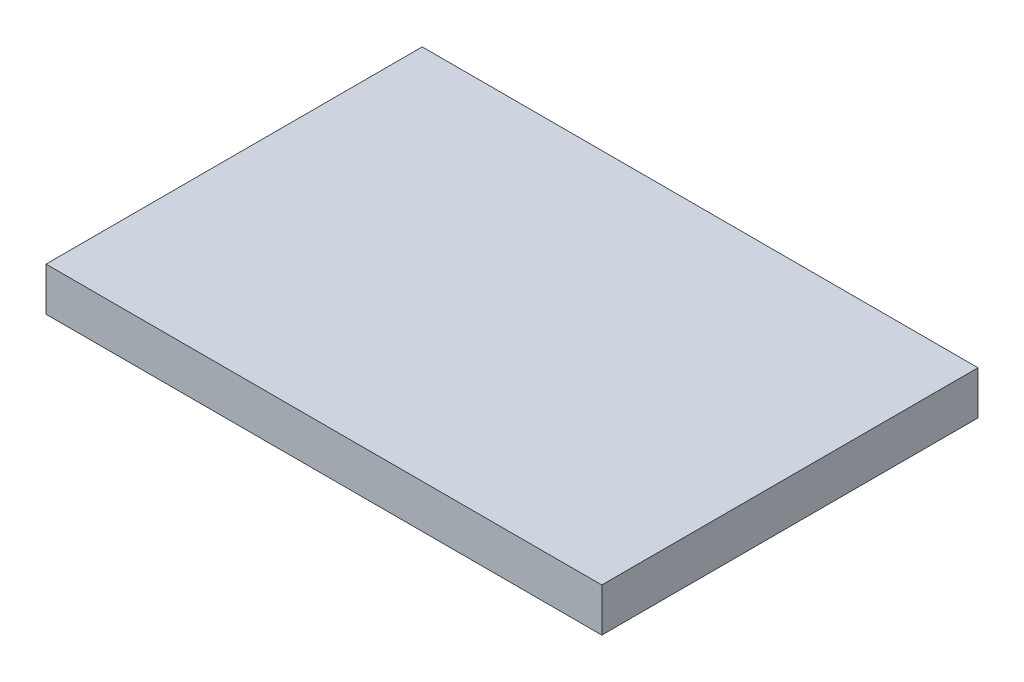
ISO-10303-21;
HEADER;
FILE_DESCRIPTION(('STEP AP214'),'2;1');
FILE_NAME('part.step','',(''),(''),'','','');
FILE_SCHEMA(('AUTOMOTIVE_DESIGN { 1 0 10303 214 1 1 1 1 }'));
ENDSEC;
DATA;
#1=APPLICATION_CONTEXT('core data for automotive mechanical design processes');
#2=APPLICATION_PROTOCOL_DEFINITION('international standard','automotive_design',2000,#1);
#3=PRODUCT_CONTEXT('',#1,'mechanical');
#4=PRODUCT('Part','Part','',(#3));
#5=PRODUCT_RELATED_PRODUCT_CATEGORY('part','',(#4));
#6=PRODUCT_DEFINITION_FORMATION('','',#4);
#7=PRODUCT_DEFINITION_CONTEXT('part definition',#1,'design');
#8=PRODUCT_DEFINITION('design','',#6,#7);
#9=PRODUCT_DEFINITION_SHAPE('','',#8);
#10=(LENGTH_UNIT() NAMED_UNIT(*) SI_UNIT(.MILLI.,.METRE.));
#11=(NAMED_UNIT(*) PLANE_ANGLE_UNIT() SI_UNIT($,.RADIAN.));
#12=(NAMED_UNIT(*) SI_UNIT($,.STERADIAN.) SOLID_ANGLE_UNIT());
#13=UNCERTAINTY_MEASURE_WITH_UNIT(LENGTH_MEASURE(1.E-05),#10,'distance_accuracy_value','');
#14=(GEOMETRIC_REPRESENTATION_CONTEXT(3) GLOBAL_UNCERTAINTY_ASSIGNED_CONTEXT((#13)) GLOBAL_UNIT_ASSIGNED_CONTEXT((#10,
#11,#12)) REPRESENTATION_CONTEXT('',''));
#15=CARTESIAN_POINT('',(0.,0.,0.));
#16=DIRECTION('',(0.,0.,1.));
#17=DIRECTION('',(1.,0.,0.));
#18=AXIS2_PLACEMENT_3D('',#15,#16,#17);
#19=CARTESIAN_POINT('',(0.,25.4,0.));
#20=DIRECTION('',(1.,0.,0.));
#21=DIRECTION('',(0.,0.,-1.));
#22=AXIS2_PLACEMENT_3D('',#19,#20,#21);
#23=PLANE('',#22);
#24=DIRECTION('',(0.,0.,1.));
#25=VECTOR('',#24,1.);
#26=CARTESIAN_POINT('',(0.,0.,0.));
#27=LINE('',#26,#25);
#28=CARTESIAN_POINT('',(0.,0.,-220.));
#29=VERTEX_POINT('',#28);
#30=CARTESIAN_POINT('',(0.,0.,0.));
#31=VERTEX_POINT('',#30);
#32=EDGE_CURVE('E97',#29,#31,#27,.T.);
#33=ORIENTED_EDGE('',*,*,#32,.T.);
#34=DIRECTION('',(0.,-1.,0.));
#35=VECTOR('',#34,1.);
#36=CARTESIAN_POINT('',(0.,25.4,0.));
#37=LINE('',#36,#35);
#38=CARTESIAN_POINT('',(0.,25.4,0.));
#39=VERTEX_POINT('',#38);
#40=EDGE_CURVE('E11',#39,#31,#37,.T.);
#41=ORIENTED_EDGE('',*,*,#40,.F.);
#42=DIRECTION('',(0.,0.,1.));
#43=VECTOR('',#42,1.);
#44=CARTESIAN_POINT('',(0.,25.4,0.));
#45=LINE('',#44,#43);
#46=CARTESIAN_POINT('',(0.,25.4,-220.));
#47=VERTEX_POINT('',#46);
#48=EDGE_CURVE('E85',#47,#39,#45,.T.);
#49=ORIENTED_EDGE('',*,*,#48,.F.);
#50=DIRECTION('',(0.,-1.,0.));
#51=VECTOR('',#50,1.);
#52=CARTESIAN_POINT('',(0.,25.4,-220.));
#53=LINE('',#52,#51);
#54=EDGE_CURVE('E93',#47,#29,#53,.T.);
#55=ORIENTED_EDGE('',*,*,#54,.T.);
#56=EDGE_LOOP('',(#33,#41,#49,#55));
#57=FACE_BOUND('',#56,.T.);
#58=ADVANCED_FACE('F34',(#57),#23,.F.);
#59=CARTESIAN_POINT('',(0.,25.4,0.));
#60=DIRECTION('',(0.,0.,-1.));
#61=DIRECTION('',(-1.,0.,0.));
#62=AXIS2_PLACEMENT_3D('',#59,#60,#61);
#63=PLANE('',#62);
#64=DIRECTION('',(1.,0.,0.));
#65=VECTOR('',#64,1.);
#66=CARTESIAN_POINT('',(0.,0.,0.));
#67=LINE('',#66,#65);
#68=CARTESIAN_POINT('',(325.,0.,0.));
#69=VERTEX_POINT('',#68);
#70=EDGE_CURVE('E89',#31,#69,#67,.T.);
#71=ORIENTED_EDGE('',*,*,#70,.T.);
#72=DIRECTION('',(0.,-1.,0.));
#73=VECTOR('',#72,1.);
#74=CARTESIAN_POINT('',(325.,25.4,0.));
#75=LINE('',#74,#73);
#76=CARTESIAN_POINT('',(325.,25.4,0.));
#77=VERTEX_POINT('',#76);
#78=EDGE_CURVE('E42',#77,#69,#75,.T.);
#79=ORIENTED_EDGE('',*,*,#78,.F.);
#80=DIRECTION('',(1.,0.,0.));
#81=VECTOR('',#80,1.);
#82=CARTESIAN_POINT('',(0.,25.4,0.));
#83=LINE('',#82,#81);
#84=EDGE_CURVE('E80',#39,#77,#83,.T.);
#85=ORIENTED_EDGE('',*,*,#84,.F.);
#86=ORIENTED_EDGE('',*,*,#40,.T.);
#87=EDGE_LOOP('',(#71,#79,#85,#86));
#88=FACE_BOUND('',#87,.T.);
#89=ADVANCED_FACE('F88',(#88),#63,.F.);
#90=CARTESIAN_POINT('',(325.,25.4,0.));
#91=DIRECTION('',(-1.,0.,0.));
#92=DIRECTION('',(0.,0.,1.));
#93=AXIS2_PLACEMENT_3D('',#90,#91,#92);
#94=PLANE('',#93);
#95=DIRECTION('',(0.,0.,-1.));
#96=VECTOR('',#95,1.);
#97=CARTESIAN_POINT('',(325.,0.,0.));
#98=LINE('',#97,#96);
#99=CARTESIAN_POINT('',(325.,0.,-220.));
#100=VERTEX_POINT('',#99);
#101=EDGE_CURVE('E67',#69,#100,#98,.T.);
#102=ORIENTED_EDGE('',*,*,#101,.T.);
#103=DIRECTION('',(0.,-1.,0.));
#104=VECTOR('',#103,1.);
#105=CARTESIAN_POINT('',(325.,25.4,-220.));
#106=LINE('',#105,#104);
#107=CARTESIAN_POINT('',(325.,25.4,-220.));
#108=VERTEX_POINT('',#107);
#109=EDGE_CURVE('E90',#108,#100,#106,.T.);
#110=ORIENTED_EDGE('',*,*,#109,.F.);
#111=DIRECTION('',(0.,0.,-1.));
#112=VECTOR('',#111,1.);
#113=CARTESIAN_POINT('',(325.,25.4,0.));
#114=LINE('',#113,#112);
#115=EDGE_CURVE('E83',#77,#108,#114,.T.);
#116=ORIENTED_EDGE('',*,*,#115,.F.);
#117=ORIENTED_EDGE('',*,*,#78,.T.);
#118=EDGE_LOOP('',(#102,#110,#116,#117));
#119=FACE_BOUND('',#118,.T.);
#120=ADVANCED_FACE('F91',(#119),#94,.F.);
#121=CARTESIAN_POINT('',(0.,25.4,-220.));
#122=DIRECTION('',(0.,0.,1.));
#123=DIRECTION('',(1.,0.,0.));
#124=AXIS2_PLACEMENT_3D('',#121,#122,#123);
#125=PLANE('',#124);
#126=DIRECTION('',(-1.,0.,0.));
#127=VECTOR('',#126,1.);
#128=CARTESIAN_POINT('',(0.,0.,-220.));
#129=LINE('',#128,#127);
#130=EDGE_CURVE('E73',#100,#29,#129,.T.);
#131=ORIENTED_EDGE('',*,*,#130,.T.);
#132=ORIENTED_EDGE('',*,*,#54,.F.);
#133=DIRECTION('',(-1.,0.,0.));
#134=VECTOR('',#133,1.);
#135=CARTESIAN_POINT('',(0.,25.4,-220.));
#136=LINE('',#135,#134);
#137=EDGE_CURVE('E50',#108,#47,#136,.T.);
#138=ORIENTED_EDGE('',*,*,#137,.F.);
#139=ORIENTED_EDGE('',*,*,#109,.T.);
#140=EDGE_LOOP('',(#131,#132,#138,#139));
#141=FACE_BOUND('',#140,.T.);
#142=ADVANCED_FACE('F104',(#141),#125,.F.);
#143=CARTESIAN_POINT('',(0.,25.4,0.));
#144=DIRECTION('',(0.,-1.,0.));
#145=DIRECTION('',(0.,0.,-1.));
#146=AXIS2_PLACEMENT_3D('',#143,#144,#145);
#147=PLANE('',#146);
#148=ORIENTED_EDGE('',*,*,#48,.T.);
#149=ORIENTED_EDGE('',*,*,#84,.T.);
#150=ORIENTED_EDGE('',*,*,#115,.T.);
#151=ORIENTED_EDGE('',*,*,#137,.T.);
#152=EDGE_LOOP('',(#148,#149,#150,#151));
#153=FACE_BOUND('',#152,.T.);
#154=ADVANCED_FACE('F81',(#153),#147,.F.);
#155=CARTESIAN_POINT('',(0.,0.,0.));
#156=DIRECTION('',(0.,-1.,0.));
#157=DIRECTION('',(0.,0.,-1.));
#158=AXIS2_PLACEMENT_3D('',#155,#156,#157);
#159=PLANE('',#158);
#160=ORIENTED_EDGE('',*,*,#32,.F.);
#161=ORIENTED_EDGE('',*,*,#130,.F.);
#162=ORIENTED_EDGE('',*,*,#101,.F.);
#163=ORIENTED_EDGE('',*,*,#70,.F.);
#164=EDGE_LOOP('',(#160,#161,#162,#163));
#165=FACE_BOUND('',#164,.T.);
#166=ADVANCED_FACE('F107',(#165),#159,.T.);
#167=CLOSED_SHELL('',(#58,#89,#120,#142,#154,#166));
#168=MANIFOLD_SOLID_BREP('B2',#167);
#169=ADVANCED_BREP_SHAPE_REPRESENTATION('',(#18,#168),#14);
#170=SHAPE_DEFINITION_REPRESENTATION(#9,#169);
ENDSEC;
END-ISO-10303-21;
